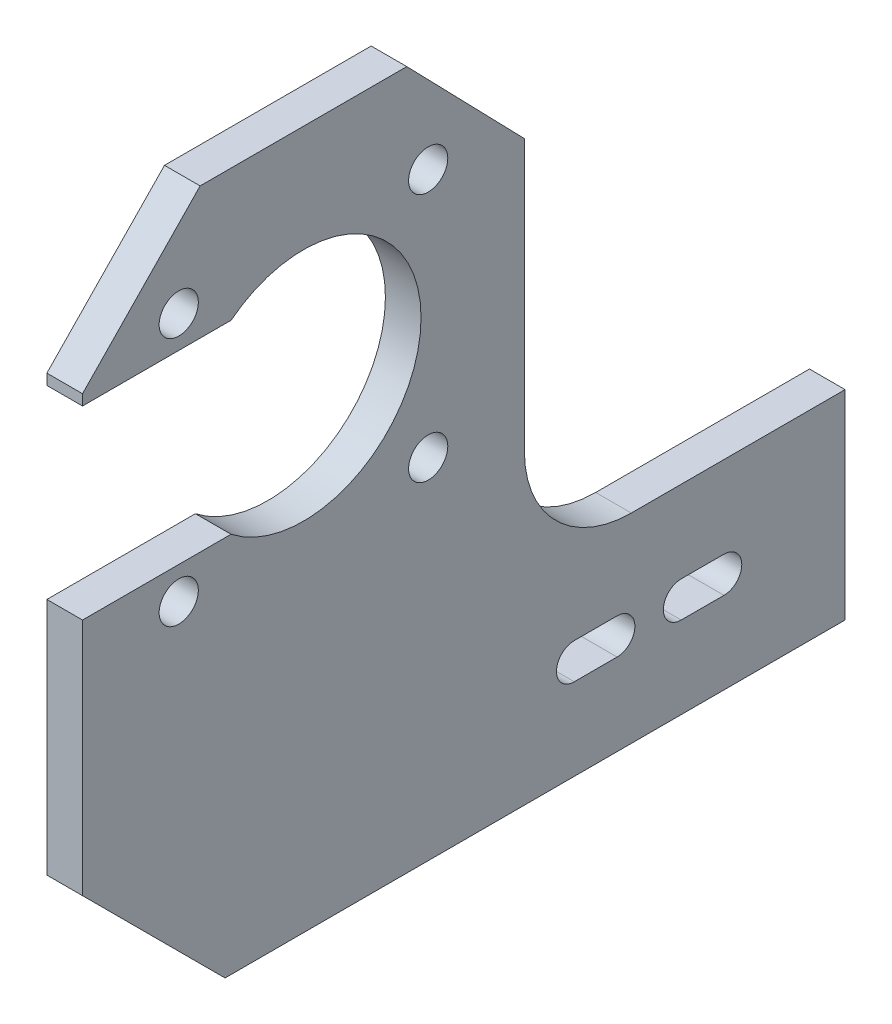
ISO-10303-21;
HEADER;
FILE_DESCRIPTION(('STEP AP214'),'2;1');
FILE_NAME('part.step','',(''),(''),'','','');
FILE_SCHEMA(('AUTOMOTIVE_DESIGN { 1 0 10303 214 1 1 1 1 }'));
ENDSEC;
DATA;
#1=APPLICATION_CONTEXT('core data for automotive mechanical design processes');
#2=APPLICATION_PROTOCOL_DEFINITION('international standard','automotive_design',2000,#1);
#3=PRODUCT_CONTEXT('',#1,'mechanical');
#4=PRODUCT('Part','Part','',(#3));
#5=PRODUCT_RELATED_PRODUCT_CATEGORY('part','',(#4));
#6=PRODUCT_DEFINITION_FORMATION('','',#4);
#7=PRODUCT_DEFINITION_CONTEXT('part definition',#1,'design');
#8=PRODUCT_DEFINITION('design','',#6,#7);
#9=PRODUCT_DEFINITION_SHAPE('','',#8);
#10=(LENGTH_UNIT() NAMED_UNIT(*) SI_UNIT(.MILLI.,.METRE.));
#11=(NAMED_UNIT(*) PLANE_ANGLE_UNIT() SI_UNIT($,.RADIAN.));
#12=(NAMED_UNIT(*) SI_UNIT($,.STERADIAN.) SOLID_ANGLE_UNIT());
#13=UNCERTAINTY_MEASURE_WITH_UNIT(LENGTH_MEASURE(1.E-05),#10,'distance_accuracy_value','');
#14=(GEOMETRIC_REPRESENTATION_CONTEXT(3) GLOBAL_UNCERTAINTY_ASSIGNED_CONTEXT((#13)) GLOBAL_UNIT_ASSIGNED_CONTEXT((#10,
#11,#12)) REPRESENTATION_CONTEXT('',''));
#15=CARTESIAN_POINT('',(0.,0.,0.));
#16=DIRECTION('',(0.,0.,1.));
#17=DIRECTION('',(1.,0.,0.));
#18=AXIS2_PLACEMENT_3D('',#15,#16,#17);
#19=CARTESIAN_POINT('',(-5.,34.5,-31.));
#20=DIRECTION('',(1.,0.,0.));
#21=DIRECTION('',(0.,0.,-1.));
#22=AXIS2_PLACEMENT_3D('',#19,#20,#21);
#23=CYLINDRICAL_SURFACE('',#22,16.5);
#24=CARTESIAN_POINT('',(0.,34.5,-31.));
#25=DIRECTION('',(1.,0.,0.));
#26=DIRECTION('',(0.,0.,-1.));
#27=AXIS2_PLACEMENT_3D('',#24,#25,#26);
#28=CIRCLE('',#27,16.5);
#29=CARTESIAN_POINT('',(0.,21.5,-20.8387992835492));
#30=VERTEX_POINT('',#29);
#31=CARTESIAN_POINT('',(0.,47.5,-20.8387992835492));
#32=VERTEX_POINT('',#31);
#33=EDGE_CURVE('E330',#30,#32,#28,.T.);
#34=ORIENTED_EDGE('',*,*,#33,.T.);
#35=DIRECTION('',(1.,0.,0.));
#36=VECTOR('',#35,1.);
#37=CARTESIAN_POINT('',(-5.,47.5,-20.8387992835492));
#38=LINE('',#37,#36);
#39=CARTESIAN_POINT('',(-5.,47.5,-20.8387992835492));
#40=VERTEX_POINT('',#39);
#41=EDGE_CURVE('E377',#40,#32,#38,.T.);
#42=ORIENTED_EDGE('',*,*,#41,.F.);
#43=CARTESIAN_POINT('',(-5.,34.5,-31.));
#44=DIRECTION('',(1.,0.,0.));
#45=DIRECTION('',(0.,0.,-1.));
#46=AXIS2_PLACEMENT_3D('',#43,#44,#45);
#47=CIRCLE('',#46,16.5);
#48=CARTESIAN_POINT('',(-5.,21.5,-20.8387992835492));
#49=VERTEX_POINT('',#48);
#50=EDGE_CURVE('E248',#49,#40,#47,.T.);
#51=ORIENTED_EDGE('',*,*,#50,.F.);
#52=DIRECTION('',(1.,0.,0.));
#53=VECTOR('',#52,1.);
#54=CARTESIAN_POINT('',(-5.,21.5,-20.8387992835492));
#55=LINE('',#54,#53);
#56=EDGE_CURVE('E410',#49,#30,#55,.T.);
#57=ORIENTED_EDGE('',*,*,#56,.T.);
#58=EDGE_LOOP('',(#34,#42,#51,#57));
#59=FACE_BOUND('',#58,.T.);
#60=ADVANCED_FACE('F43',(#59),#23,.F.);
#61=CARTESIAN_POINT('',(-5.,47.5,0.));
#62=DIRECTION('',(0.,-1.,0.));
#63=DIRECTION('',(0.,0.,-1.));
#64=AXIS2_PLACEMENT_3D('',#61,#62,#63);
#65=PLANE('',#64);
#66=DIRECTION('',(0.,0.,-1.));
#67=VECTOR('',#66,1.);
#68=CARTESIAN_POINT('',(0.,47.5,0.));
#69=LINE('',#68,#67);
#70=CARTESIAN_POINT('',(0.,47.5,-1.00829253129798E-13));
#71=VERTEX_POINT('',#70);
#72=EDGE_CURVE('E368',#71,#32,#69,.T.);
#73=ORIENTED_EDGE('',*,*,#72,.F.);
#74=DIRECTION('',(1.,0.,0.));
#75=VECTOR('',#74,1.);
#76=CARTESIAN_POINT('',(-5.,47.5,-1.00829253129798E-13));
#77=LINE('',#76,#75);
#78=CARTESIAN_POINT('',(-5.,47.5,-1.00829253129798E-13));
#79=VERTEX_POINT('',#78);
#80=EDGE_CURVE('E381',#79,#71,#77,.T.);
#81=ORIENTED_EDGE('',*,*,#80,.F.);
#82=DIRECTION('',(0.,0.,-1.));
#83=VECTOR('',#82,1.);
#84=CARTESIAN_POINT('',(-5.,47.5,0.));
#85=LINE('',#84,#83);
#86=EDGE_CURVE('E285',#79,#40,#85,.T.);
#87=ORIENTED_EDGE('',*,*,#86,.T.);
#88=ORIENTED_EDGE('',*,*,#41,.T.);
#89=EDGE_LOOP('',(#73,#81,#87,#88));
#90=FACE_BOUND('',#89,.T.);
#91=ADVANCED_FACE('F483',(#90),#65,.T.);
#92=CARTESIAN_POINT('',(-5.,0.,0.));
#93=DIRECTION('',(0.,0.,1.));
#94=DIRECTION('',(0.,-1.,0.));
#95=AXIS2_PLACEMENT_3D('',#92,#93,#94);
#96=PLANE('',#95);
#97=DIRECTION('',(0.,-1.,0.));
#98=VECTOR('',#97,1.);
#99=CARTESIAN_POINT('',(0.,0.,0.));
#100=LINE('',#99,#98);
#101=CARTESIAN_POINT('',(0.,49.,0.));
#102=VERTEX_POINT('',#101);
#103=EDGE_CURVE('E364',#102,#71,#100,.T.);
#104=ORIENTED_EDGE('',*,*,#103,.F.);
#105=DIRECTION('',(1.,0.,0.));
#106=VECTOR('',#105,1.);
#107=CARTESIAN_POINT('',(-5.,49.,0.));
#108=LINE('',#107,#106);
#109=CARTESIAN_POINT('',(-5.,49.,0.));
#110=VERTEX_POINT('',#109);
#111=EDGE_CURVE('E384',#110,#102,#108,.T.);
#112=ORIENTED_EDGE('',*,*,#111,.F.);
#113=DIRECTION('',(0.,-1.,0.));
#114=VECTOR('',#113,1.);
#115=CARTESIAN_POINT('',(-5.,0.,0.));
#116=LINE('',#115,#114);
#117=EDGE_CURVE('E281',#110,#79,#116,.T.);
#118=ORIENTED_EDGE('',*,*,#117,.T.);
#119=ORIENTED_EDGE('',*,*,#80,.T.);
#120=EDGE_LOOP('',(#104,#112,#118,#119));
#121=FACE_BOUND('',#120,.T.);
#122=ADVANCED_FACE('F488',(#121),#96,.T.);
#123=CARTESIAN_POINT('',(-5.,23.7688195991091,24.4890868596882));
#124=DIRECTION('',(0.,-0.69647537716866,-0.717580691628317));
#125=DIRECTION('',(0.,0.717580691628317,-0.69647537716866));
#126=AXIS2_PLACEMENT_3D('',#123,#124,#125);
#127=PLANE('',#126);
#128=DIRECTION('',(0.,0.717580691628317,-0.69647537716866));
#129=VECTOR('',#128,1.);
#130=CARTESIAN_POINT('',(0.,23.7688195991091,24.4890868596882));
#131=LINE('',#130,#129);
#132=CARTESIAN_POINT('',(0.,66.,-16.5));
#133=VERTEX_POINT('',#132);
#134=EDGE_CURVE('E361',#102,#133,#131,.T.);
#135=ORIENTED_EDGE('',*,*,#134,.T.);
#136=DIRECTION('',(1.,0.,0.));
#137=VECTOR('',#136,1.);
#138=CARTESIAN_POINT('',(-5.,66.,-16.5));
#139=LINE('',#138,#137);
#140=CARTESIAN_POINT('',(-5.,66.,-16.5));
#141=VERTEX_POINT('',#140);
#142=EDGE_CURVE('E387',#141,#133,#139,.T.);
#143=ORIENTED_EDGE('',*,*,#142,.F.);
#144=DIRECTION('',(0.,0.717580691628317,-0.69647537716866));
#145=VECTOR('',#144,1.);
#146=CARTESIAN_POINT('',(-5.,23.7688195991091,24.4890868596882));
#147=LINE('',#146,#145);
#148=EDGE_CURVE('E278',#110,#141,#147,.T.);
#149=ORIENTED_EDGE('',*,*,#148,.F.);
#150=ORIENTED_EDGE('',*,*,#111,.T.);
#151=EDGE_LOOP('',(#135,#143,#149,#150));
#152=FACE_BOUND('',#151,.T.);
#153=ADVANCED_FACE('F572',(#152),#127,.F.);
#154=CARTESIAN_POINT('',(-5.,66.,0.));
#155=DIRECTION('',(0.,-1.,0.));
#156=DIRECTION('',(0.,0.,-1.));
#157=AXIS2_PLACEMENT_3D('',#154,#155,#156);
#158=PLANE('',#157);
#159=DIRECTION('',(0.,0.,-1.));
#160=VECTOR('',#159,1.);
#161=CARTESIAN_POINT('',(0.,66.,0.));
#162=LINE('',#161,#160);
#163=CARTESIAN_POINT('',(0.,66.,-45.5));
#164=VERTEX_POINT('',#163);
#165=EDGE_CURVE('E358',#133,#164,#162,.T.);
#166=ORIENTED_EDGE('',*,*,#165,.T.);
#167=DIRECTION('',(1.,0.,0.));
#168=VECTOR('',#167,1.);
#169=CARTESIAN_POINT('',(-5.,66.,-45.5));
#170=LINE('',#169,#168);
#171=CARTESIAN_POINT('',(-5.,66.,-45.5));
#172=VERTEX_POINT('',#171);
#173=EDGE_CURVE('E391',#172,#164,#170,.T.);
#174=ORIENTED_EDGE('',*,*,#173,.F.);
#175=DIRECTION('',(0.,0.,-1.));
#176=VECTOR('',#175,1.);
#177=CARTESIAN_POINT('',(-5.,66.,0.));
#178=LINE('',#177,#176);
#179=EDGE_CURVE('E275',#141,#172,#178,.T.);
#180=ORIENTED_EDGE('',*,*,#179,.F.);
#181=ORIENTED_EDGE('',*,*,#142,.T.);
#182=EDGE_LOOP('',(#166,#174,#180,#181));
#183=FACE_BOUND('',#182,.T.);
#184=ADVANCED_FACE('F576',(#183),#158,.F.);
#185=CARTESIAN_POINT('',(-5.,54.7550111358575,-56.4142538975501));
#186=DIRECTION('',(0.,-0.69647537716866,0.717580691628316));
#187=DIRECTION('',(0.,-0.717580691628316,-0.69647537716866));
#188=AXIS2_PLACEMENT_3D('',#185,#186,#187);
#189=PLANE('',#188);
#190=DIRECTION('',(0.,-0.717580691628316,-0.69647537716866));
#191=VECTOR('',#190,1.);
#192=CARTESIAN_POINT('',(0.,54.7550111358575,-56.4142538975501));
#193=LINE('',#192,#191);
#194=CARTESIAN_POINT('',(0.,49.,-62.));
#195=VERTEX_POINT('',#194);
#196=EDGE_CURVE('E354',#164,#195,#193,.T.);
#197=ORIENTED_EDGE('',*,*,#196,.T.);
#198=DIRECTION('',(1.,0.,0.));
#199=VECTOR('',#198,1.);
#200=CARTESIAN_POINT('',(-5.,49.,-62.));
#201=LINE('',#200,#199);
#202=CARTESIAN_POINT('',(-5.,49.,-62.));
#203=VERTEX_POINT('',#202);
#204=EDGE_CURVE('E395',#203,#195,#201,.T.);
#205=ORIENTED_EDGE('',*,*,#204,.F.);
#206=DIRECTION('',(0.,-0.717580691628316,-0.69647537716866));
#207=VECTOR('',#206,1.);
#208=CARTESIAN_POINT('',(-5.,54.7550111358575,-56.4142538975501));
#209=LINE('',#208,#207);
#210=EDGE_CURVE('E271',#172,#203,#209,.T.);
#211=ORIENTED_EDGE('',*,*,#210,.F.);
#212=ORIENTED_EDGE('',*,*,#173,.T.);
#213=EDGE_LOOP('',(#197,#205,#211,#212));
#214=FACE_BOUND('',#213,.T.);
#215=ADVANCED_FACE('F580',(#214),#189,.F.);
#216=CARTESIAN_POINT('',(-5.,0.,-62.));
#217=DIRECTION('',(0.,0.,-1.));
#218=DIRECTION('',(-1.,0.,0.));
#219=AXIS2_PLACEMENT_3D('',#216,#217,#218);
#220=PLANE('',#219);
#221=DIRECTION('',(0.,1.,0.));
#222=VECTOR('',#221,1.);
#223=CARTESIAN_POINT('',(0.,0.,-62.));
#224=LINE('',#223,#222);
#225=CARTESIAN_POINT('',(0.,11.,-62.));
#226=VERTEX_POINT('',#225);
#227=EDGE_CURVE('E351',#226,#195,#224,.T.);
#228=ORIENTED_EDGE('',*,*,#227,.F.);
#229=DIRECTION('',(1.,0.,0.));
#230=VECTOR('',#229,1.);
#231=CARTESIAN_POINT('',(-5.,11.,-62.));
#232=LINE('',#231,#230);
#233=CARTESIAN_POINT('',(-5.,11.,-62.));
#234=VERTEX_POINT('',#233);
#235=EDGE_CURVE('E438',#226,#234,#232,.F.);
#236=ORIENTED_EDGE('',*,*,#235,.T.);
#237=DIRECTION('',(0.,1.,0.));
#238=VECTOR('',#237,1.);
#239=CARTESIAN_POINT('',(-5.,0.,-62.));
#240=LINE('',#239,#238);
#241=EDGE_CURVE('E268',#234,#203,#240,.T.);
#242=ORIENTED_EDGE('',*,*,#241,.T.);
#243=ORIENTED_EDGE('',*,*,#204,.T.);
#244=EDGE_LOOP('',(#228,#236,#242,#243));
#245=FACE_BOUND('',#244,.T.);
#246=ADVANCED_FACE('F584',(#245),#220,.T.);
#247=CARTESIAN_POINT('',(-5.,-4.00000000000001,0.));
#248=DIRECTION('',(0.,1.,0.));
#249=DIRECTION('',(0.,0.,1.));
#250=AXIS2_PLACEMENT_3D('',#247,#248,#249);
#251=PLANE('',#250);
#252=DIRECTION('',(0.,0.,1.));
#253=VECTOR('',#252,1.);
#254=CARTESIAN_POINT('',(-5.,-4.00000000000001,0.));
#255=LINE('',#254,#253);
#256=CARTESIAN_POINT('',(-5.,-4.,-107.));
#257=VERTEX_POINT('',#256);
#258=CARTESIAN_POINT('',(-5.,-4.,-77.));
#259=VERTEX_POINT('',#258);
#260=EDGE_CURVE('E264',#257,#259,#255,.T.);
#261=ORIENTED_EDGE('',*,*,#260,.T.);
#262=DIRECTION('',(1.,0.,0.));
#263=VECTOR('',#262,1.);
#264=CARTESIAN_POINT('',(0.,-4.,-77.));
#265=LINE('',#264,#263);
#266=CARTESIAN_POINT('',(0.,-4.,-77.));
#267=VERTEX_POINT('',#266);
#268=EDGE_CURVE('E380',#259,#267,#265,.T.);
#269=ORIENTED_EDGE('',*,*,#268,.T.);
#270=DIRECTION('',(0.,0.,1.));
#271=VECTOR('',#270,1.);
#272=CARTESIAN_POINT('',(0.,-4.00000000000001,0.));
#273=LINE('',#272,#271);
#274=CARTESIAN_POINT('',(0.,-4.,-107.));
#275=VERTEX_POINT('',#274);
#276=EDGE_CURVE('E347',#275,#267,#273,.T.);
#277=ORIENTED_EDGE('',*,*,#276,.F.);
#278=DIRECTION('',(1.,0.,0.));
#279=VECTOR('',#278,1.);
#280=CARTESIAN_POINT('',(-5.,-4.,-107.));
#281=LINE('',#280,#279);
#282=EDGE_CURVE('E399',#257,#275,#281,.T.);
#283=ORIENTED_EDGE('',*,*,#282,.F.);
#284=EDGE_LOOP('',(#261,#269,#277,#283));
#285=FACE_BOUND('',#284,.T.);
#286=ADVANCED_FACE('F588',(#285),#251,.T.);
#287=CARTESIAN_POINT('',(-5.,0.,-107.));
#288=DIRECTION('',(0.,0.,-1.));
#289=DIRECTION('',(-1.,0.,0.));
#290=AXIS2_PLACEMENT_3D('',#287,#288,#289);
#291=PLANE('',#290);
#292=DIRECTION('',(0.,1.,0.));
#293=VECTOR('',#292,1.);
#294=CARTESIAN_POINT('',(0.,0.,-107.));
#295=LINE('',#294,#293);
#296=CARTESIAN_POINT('',(0.,-32.,-107.));
#297=VERTEX_POINT('',#296);
#298=EDGE_CURVE('E343',#297,#275,#295,.T.);
#299=ORIENTED_EDGE('',*,*,#298,.F.);
#300=DIRECTION('',(1.,0.,0.));
#301=VECTOR('',#300,1.);
#302=CARTESIAN_POINT('',(-5.,-32.,-107.));
#303=LINE('',#302,#301);
#304=CARTESIAN_POINT('',(-5.,-32.,-107.));
#305=VERTEX_POINT('',#304);
#306=EDGE_CURVE('E402',#305,#297,#303,.T.);
#307=ORIENTED_EDGE('',*,*,#306,.F.);
#308=DIRECTION('',(0.,1.,0.));
#309=VECTOR('',#308,1.);
#310=CARTESIAN_POINT('',(-5.,0.,-107.));
#311=LINE('',#310,#309);
#312=EDGE_CURVE('E260',#305,#257,#311,.T.);
#313=ORIENTED_EDGE('',*,*,#312,.T.);
#314=ORIENTED_EDGE('',*,*,#282,.T.);
#315=EDGE_LOOP('',(#299,#307,#313,#314));
#316=FACE_BOUND('',#315,.T.);
#317=ADVANCED_FACE('F592',(#316),#291,.T.);
#318=CARTESIAN_POINT('',(-5.,-32.,0.));
#319=DIRECTION('',(0.,-1.,0.));
#320=DIRECTION('',(0.,0.,-1.));
#321=AXIS2_PLACEMENT_3D('',#318,#319,#320);
#322=PLANE('',#321);
#323=DIRECTION('',(0.,0.,-1.));
#324=VECTOR('',#323,1.);
#325=CARTESIAN_POINT('',(0.,-32.,0.));
#326=LINE('',#325,#324);
#327=CARTESIAN_POINT('',(0.,-32.,-20.0000000000001));
#328=VERTEX_POINT('',#327);
#329=EDGE_CURVE('E340',#328,#297,#326,.T.);
#330=ORIENTED_EDGE('',*,*,#329,.F.);
#331=DIRECTION('',(-1.,0.,0.));
#332=VECTOR('',#331,1.);
#333=CARTESIAN_POINT('',(-5.,-32.,-20.0000000000001));
#334=LINE('',#333,#332);
#335=CARTESIAN_POINT('',(-5.,-32.,-20.0000000000001));
#336=VERTEX_POINT('',#335);
#337=EDGE_CURVE('E53',#328,#336,#334,.T.);
#338=ORIENTED_EDGE('',*,*,#337,.T.);
#339=DIRECTION('',(0.,0.,-1.));
#340=VECTOR('',#339,1.);
#341=CARTESIAN_POINT('',(-5.,-32.,0.));
#342=LINE('',#341,#340);
#343=EDGE_CURVE('E257',#336,#305,#342,.T.);
#344=ORIENTED_EDGE('',*,*,#343,.T.);
#345=ORIENTED_EDGE('',*,*,#306,.T.);
#346=EDGE_LOOP('',(#330,#338,#344,#345));
#347=FACE_BOUND('',#346,.T.);
#348=ADVANCED_FACE('F596',(#347),#322,.T.);
#349=CARTESIAN_POINT('',(-5.,0.,0.));
#350=DIRECTION('',(0.,0.,-1.));
#351=DIRECTION('',(-1.,0.,0.));
#352=AXIS2_PLACEMENT_3D('',#349,#350,#351);
#353=PLANE('',#352);
#354=DIRECTION('',(0.,1.,0.));
#355=VECTOR('',#354,1.);
#356=CARTESIAN_POINT('',(-5.,0.,0.));
#357=LINE('',#356,#355);
#358=CARTESIAN_POINT('',(-5.,-12.,0.));
#359=VERTEX_POINT('',#358);
#360=CARTESIAN_POINT('',(-5.,21.5,0.));
#361=VERTEX_POINT('',#360);
#362=EDGE_CURVE('E254',#359,#361,#357,.T.);
#363=ORIENTED_EDGE('',*,*,#362,.F.);
#364=DIRECTION('',(1.,0.,0.));
#365=VECTOR('',#364,1.);
#366=CARTESIAN_POINT('',(0.,-12.,0.));
#367=LINE('',#366,#365);
#368=CARTESIAN_POINT('',(0.,-12.,0.));
#369=VERTEX_POINT('',#368);
#370=EDGE_CURVE('E447',#359,#369,#367,.T.);
#371=ORIENTED_EDGE('',*,*,#370,.T.);
#372=DIRECTION('',(0.,1.,0.));
#373=VECTOR('',#372,1.);
#374=CARTESIAN_POINT('',(0.,0.,0.));
#375=LINE('',#374,#373);
#376=CARTESIAN_POINT('',(0.,21.5,0.));
#377=VERTEX_POINT('',#376);
#378=EDGE_CURVE('E337',#369,#377,#375,.T.);
#379=ORIENTED_EDGE('',*,*,#378,.T.);
#380=DIRECTION('',(1.,0.,0.));
#381=VECTOR('',#380,1.);
#382=CARTESIAN_POINT('',(-5.,21.5,0.));
#383=LINE('',#382,#381);
#384=EDGE_CURVE('E406',#361,#377,#383,.T.);
#385=ORIENTED_EDGE('',*,*,#384,.F.);
#386=EDGE_LOOP('',(#363,#371,#379,#385));
#387=FACE_BOUND('',#386,.T.);
#388=ADVANCED_FACE('F456',(#387),#353,.F.);
#389=CARTESIAN_POINT('',(-5.,-18.,-75.));
#390=DIRECTION('',(1.,0.,0.));
#391=DIRECTION('',(0.,0.,-1.));
#392=AXIS2_PLACEMENT_3D('',#389,#390,#391);
#393=CYLINDRICAL_SURFACE('',#392,2.5);
#394=CARTESIAN_POINT('',(0.,-18.,-75.));
#395=DIRECTION('',(1.,0.,0.));
#396=DIRECTION('',(0.,0.,-1.));
#397=AXIS2_PLACEMENT_3D('',#394,#395,#396);
#398=CIRCLE('',#397,2.5);
#399=CARTESIAN_POINT('',(0.,-20.5,-75.));
#400=VERTEX_POINT('',#399);
#401=CARTESIAN_POINT('',(0.,-15.5,-75.));
#402=VERTEX_POINT('',#401);
#403=EDGE_CURVE('E316',#400,#402,#398,.T.);
#404=ORIENTED_EDGE('',*,*,#403,.T.);
#405=DIRECTION('',(1.,0.,0.));
#406=VECTOR('',#405,1.);
#407=CARTESIAN_POINT('',(-5.,-15.5,-75.));
#408=LINE('',#407,#406);
#409=CARTESIAN_POINT('',(-5.,-15.5,-75.));
#410=VERTEX_POINT('',#409);
#411=EDGE_CURVE('E414',#410,#402,#408,.T.);
#412=ORIENTED_EDGE('',*,*,#411,.F.);
#413=CARTESIAN_POINT('',(-5.,-18.,-75.));
#414=DIRECTION('',(1.,0.,0.));
#415=DIRECTION('',(0.,0.,-1.));
#416=AXIS2_PLACEMENT_3D('',#413,#414,#415);
#417=CIRCLE('',#416,2.5);
#418=CARTESIAN_POINT('',(-5.,-20.5,-75.));
#419=VERTEX_POINT('',#418);
#420=EDGE_CURVE('E235',#419,#410,#417,.T.);
#421=ORIENTED_EDGE('',*,*,#420,.F.);
#422=DIRECTION('',(1.,0.,0.));
#423=VECTOR('',#422,1.);
#424=CARTESIAN_POINT('',(-5.,-20.5,-75.));
#425=LINE('',#424,#423);
#426=EDGE_CURVE('E424',#419,#400,#425,.T.);
#427=ORIENTED_EDGE('',*,*,#426,.T.);
#428=EDGE_LOOP('',(#404,#412,#421,#427));
#429=FACE_BOUND('',#428,.T.);
#430=ADVANCED_FACE('F498',(#429),#393,.F.);
#431=CARTESIAN_POINT('',(-5.,-15.5,0.));
#432=DIRECTION('',(0.,-1.,0.));
#433=DIRECTION('',(0.,0.,-1.));
#434=AXIS2_PLACEMENT_3D('',#431,#432,#433);
#435=PLANE('',#434);
#436=DIRECTION('',(0.,0.,-1.));
#437=VECTOR('',#436,1.);
#438=CARTESIAN_POINT('',(0.,-15.5,0.));
#439=LINE('',#438,#437);
#440=CARTESIAN_POINT('',(0.,-15.5,-69.));
#441=VERTEX_POINT('',#440);
#442=EDGE_CURVE('E326',#441,#402,#439,.T.);
#443=ORIENTED_EDGE('',*,*,#442,.F.);
#444=DIRECTION('',(1.,0.,0.));
#445=VECTOR('',#444,1.);
#446=CARTESIAN_POINT('',(-5.,-15.5,-69.));
#447=LINE('',#446,#445);
#448=CARTESIAN_POINT('',(-5.,-15.5,-69.));
#449=VERTEX_POINT('',#448);
#450=EDGE_CURVE('E417',#449,#441,#447,.T.);
#451=ORIENTED_EDGE('',*,*,#450,.F.);
#452=DIRECTION('',(0.,0.,-1.));
#453=VECTOR('',#452,1.);
#454=CARTESIAN_POINT('',(-5.,-15.5,0.));
#455=LINE('',#454,#453);
#456=EDGE_CURVE('E244',#449,#410,#455,.T.);
#457=ORIENTED_EDGE('',*,*,#456,.T.);
#458=ORIENTED_EDGE('',*,*,#411,.T.);
#459=EDGE_LOOP('',(#443,#451,#457,#458));
#460=FACE_BOUND('',#459,.T.);
#461=ADVANCED_FACE('F494',(#460),#435,.T.);
#462=CARTESIAN_POINT('',(-5.,-18.,-69.));
#463=DIRECTION('',(1.,0.,0.));
#464=DIRECTION('',(0.,0.,-1.));
#465=AXIS2_PLACEMENT_3D('',#462,#463,#464);
#466=CYLINDRICAL_SURFACE('',#465,2.5);
#467=CARTESIAN_POINT('',(0.,-18.,-69.));
#468=DIRECTION('',(1.,0.,0.));
#469=DIRECTION('',(0.,0.,-1.));
#470=AXIS2_PLACEMENT_3D('',#467,#468,#469);
#471=CIRCLE('',#470,2.5);
#472=CARTESIAN_POINT('',(0.,-20.5,-69.));
#473=VERTEX_POINT('',#472);
#474=EDGE_CURVE('E323',#441,#473,#471,.T.);
#475=ORIENTED_EDGE('',*,*,#474,.T.);
#476=DIRECTION('',(1.,0.,0.));
#477=VECTOR('',#476,1.);
#478=CARTESIAN_POINT('',(-5.,-20.5,-69.));
#479=LINE('',#478,#477);
#480=CARTESIAN_POINT('',(-5.,-20.5,-69.));
#481=VERTEX_POINT('',#480);
#482=EDGE_CURVE('E420',#481,#473,#479,.T.);
#483=ORIENTED_EDGE('',*,*,#482,.F.);
#484=CARTESIAN_POINT('',(-5.,-18.,-69.));
#485=DIRECTION('',(1.,0.,0.));
#486=DIRECTION('',(0.,0.,-1.));
#487=AXIS2_PLACEMENT_3D('',#484,#485,#486);
#488=CIRCLE('',#487,2.5);
#489=EDGE_CURVE('E241',#449,#481,#488,.T.);
#490=ORIENTED_EDGE('',*,*,#489,.F.);
#491=ORIENTED_EDGE('',*,*,#450,.T.);
#492=EDGE_LOOP('',(#475,#483,#490,#491));
#493=FACE_BOUND('',#492,.T.);
#494=ADVANCED_FACE('F497',(#493),#466,.F.);
#495=CARTESIAN_POINT('',(-5.,-18.,-90.));
#496=DIRECTION('',(1.,0.,0.));
#497=DIRECTION('',(0.,0.,-1.));
#498=AXIS2_PLACEMENT_3D('',#495,#496,#497);
#499=CYLINDRICAL_SURFACE('',#498,2.5);
#500=CARTESIAN_POINT('',(0.,-18.,-90.));
#501=DIRECTION('',(1.,0.,0.));
#502=DIRECTION('',(0.,0.,-1.));
#503=AXIS2_PLACEMENT_3D('',#500,#501,#502);
#504=CIRCLE('',#503,2.5);
#505=CARTESIAN_POINT('',(0.,-20.5,-90.));
#506=VERTEX_POINT('',#505);
#507=CARTESIAN_POINT('',(0.,-15.5,-90.));
#508=VERTEX_POINT('',#507);
#509=EDGE_CURVE('E304',#506,#508,#504,.T.);
#510=ORIENTED_EDGE('',*,*,#509,.T.);
#511=DIRECTION('',(1.,0.,0.));
#512=VECTOR('',#511,1.);
#513=CARTESIAN_POINT('',(-5.,-15.5,-90.));
#514=LINE('',#513,#512);
#515=CARTESIAN_POINT('',(-5.,-15.5,-90.));
#516=VERTEX_POINT('',#515);
#517=EDGE_CURVE('E219',#516,#508,#514,.T.);
#518=ORIENTED_EDGE('',*,*,#517,.F.);
#519=CARTESIAN_POINT('',(-5.,-18.,-90.));
#520=DIRECTION('',(1.,0.,0.));
#521=DIRECTION('',(0.,0.,-1.));
#522=AXIS2_PLACEMENT_3D('',#519,#520,#521);
#523=CIRCLE('',#522,2.5);
#524=CARTESIAN_POINT('',(-5.,-20.5,-90.));
#525=VERTEX_POINT('',#524);
#526=EDGE_CURVE('E197',#525,#516,#523,.T.);
#527=ORIENTED_EDGE('',*,*,#526,.F.);
#528=DIRECTION('',(1.,0.,0.));
#529=VECTOR('',#528,1.);
#530=CARTESIAN_POINT('',(-5.,-20.5,-90.));
#531=LINE('',#530,#529);
#532=EDGE_CURVE('E207',#525,#506,#531,.T.);
#533=ORIENTED_EDGE('',*,*,#532,.T.);
#534=EDGE_LOOP('',(#510,#518,#527,#533));
#535=FACE_BOUND('',#534,.T.);
#536=ADVANCED_FACE('F218',(#535),#499,.F.);
#537=CARTESIAN_POINT('',(-5.,-15.5,0.));
#538=DIRECTION('',(0.,-1.,0.));
#539=DIRECTION('',(0.,0.,-1.));
#540=AXIS2_PLACEMENT_3D('',#537,#538,#539);
#541=PLANE('',#540);
#542=DIRECTION('',(0.,0.,-1.));
#543=VECTOR('',#542,1.);
#544=CARTESIAN_POINT('',(0.,-15.5,0.));
#545=LINE('',#544,#543);
#546=CARTESIAN_POINT('',(0.,-15.5,-84.));
#547=VERTEX_POINT('',#546);
#548=EDGE_CURVE('E312',#547,#508,#545,.T.);
#549=ORIENTED_EDGE('',*,*,#548,.F.);
#550=DIRECTION('',(1.,0.,0.));
#551=VECTOR('',#550,1.);
#552=CARTESIAN_POINT('',(-5.,-15.5,-84.));
#553=LINE('',#552,#551);
#554=CARTESIAN_POINT('',(-5.,-15.5,-84.));
#555=VERTEX_POINT('',#554);
#556=EDGE_CURVE('E430',#555,#547,#553,.T.);
#557=ORIENTED_EDGE('',*,*,#556,.F.);
#558=DIRECTION('',(0.,0.,-1.));
#559=VECTOR('',#558,1.);
#560=CARTESIAN_POINT('',(-5.,-15.5,0.));
#561=LINE('',#560,#559);
#562=EDGE_CURVE('E232',#555,#516,#561,.T.);
#563=ORIENTED_EDGE('',*,*,#562,.T.);
#564=ORIENTED_EDGE('',*,*,#517,.T.);
#565=EDGE_LOOP('',(#549,#557,#563,#564));
#566=FACE_BOUND('',#565,.T.);
#567=ADVANCED_FACE('F510',(#566),#541,.T.);
#568=CARTESIAN_POINT('',(-5.,-18.,-84.));
#569=DIRECTION('',(1.,0.,0.));
#570=DIRECTION('',(0.,0.,-1.));
#571=AXIS2_PLACEMENT_3D('',#568,#569,#570);
#572=CYLINDRICAL_SURFACE('',#571,2.5);
#573=CARTESIAN_POINT('',(0.,-18.,-84.));
#574=DIRECTION('',(1.,0.,0.));
#575=DIRECTION('',(0.,0.,-1.));
#576=AXIS2_PLACEMENT_3D('',#573,#574,#575);
#577=CIRCLE('',#576,2.5);
#578=CARTESIAN_POINT('',(0.,-20.5,-84.));
#579=VERTEX_POINT('',#578);
#580=EDGE_CURVE('E309',#547,#579,#577,.T.);
#581=ORIENTED_EDGE('',*,*,#580,.T.);
#582=DIRECTION('',(1.,0.,0.));
#583=VECTOR('',#582,1.);
#584=CARTESIAN_POINT('',(-5.,-20.5,-84.));
#585=LINE('',#584,#583);
#586=CARTESIAN_POINT('',(-5.,-20.5,-84.));
#587=VERTEX_POINT('',#586);
#588=EDGE_CURVE('E215',#587,#579,#585,.T.);
#589=ORIENTED_EDGE('',*,*,#588,.F.);
#590=CARTESIAN_POINT('',(-5.,-18.,-84.));
#591=DIRECTION('',(1.,0.,0.));
#592=DIRECTION('',(0.,0.,-1.));
#593=AXIS2_PLACEMENT_3D('',#590,#591,#592);
#594=CIRCLE('',#593,2.5);
#595=EDGE_CURVE('E200',#555,#587,#594,.T.);
#596=ORIENTED_EDGE('',*,*,#595,.F.);
#597=ORIENTED_EDGE('',*,*,#556,.T.);
#598=EDGE_LOOP('',(#581,#589,#596,#597));
#599=FACE_BOUND('',#598,.T.);
#600=ADVANCED_FACE('F513',(#599),#572,.F.);
#601=CARTESIAN_POINT('',(-5.,21.5,0.));
#602=DIRECTION('',(0.,-1.,0.));
#603=DIRECTION('',(0.,0.,-1.));
#604=AXIS2_PLACEMENT_3D('',#601,#602,#603);
#605=PLANE('',#604);
#606=DIRECTION('',(0.,0.,-1.));
#607=VECTOR('',#606,1.);
#608=CARTESIAN_POINT('',(0.,21.5,0.));
#609=LINE('',#608,#607);
#610=EDGE_CURVE('E334',#377,#30,#609,.T.);
#611=ORIENTED_EDGE('',*,*,#610,.T.);
#612=ORIENTED_EDGE('',*,*,#56,.F.);
#613=DIRECTION('',(0.,0.,-1.));
#614=VECTOR('',#613,1.);
#615=CARTESIAN_POINT('',(-5.,21.5,0.));
#616=LINE('',#615,#614);
#617=EDGE_CURVE('E251',#361,#49,#616,.T.);
#618=ORIENTED_EDGE('',*,*,#617,.F.);
#619=ORIENTED_EDGE('',*,*,#384,.T.);
#620=EDGE_LOOP('',(#611,#612,#618,#619));
#621=FACE_BOUND('',#620,.T.);
#622=ADVANCED_FACE('F466',(#621),#605,.F.);
#623=CARTESIAN_POINT('',(-5.,-20.5,0.));
#624=DIRECTION('',(0.,-1.,0.));
#625=DIRECTION('',(0.,0.,-1.));
#626=AXIS2_PLACEMENT_3D('',#623,#624,#625);
#627=PLANE('',#626);
#628=DIRECTION('',(0.,0.,-1.));
#629=VECTOR('',#628,1.);
#630=CARTESIAN_POINT('',(0.,-20.5,0.));
#631=LINE('',#630,#629);
#632=EDGE_CURVE('E320',#473,#400,#631,.T.);
#633=ORIENTED_EDGE('',*,*,#632,.T.);
#634=ORIENTED_EDGE('',*,*,#426,.F.);
#635=DIRECTION('',(0.,0.,-1.));
#636=VECTOR('',#635,1.);
#637=CARTESIAN_POINT('',(-5.,-20.5,0.));
#638=LINE('',#637,#636);
#639=EDGE_CURVE('E238',#481,#419,#638,.T.);
#640=ORIENTED_EDGE('',*,*,#639,.F.);
#641=ORIENTED_EDGE('',*,*,#482,.T.);
#642=EDGE_LOOP('',(#633,#634,#640,#641));
#643=FACE_BOUND('',#642,.T.);
#644=ADVANCED_FACE('F503',(#643),#627,.F.);
#645=CARTESIAN_POINT('',(-5.,-20.5,0.));
#646=DIRECTION('',(0.,-1.,0.));
#647=DIRECTION('',(0.,0.,-1.));
#648=AXIS2_PLACEMENT_3D('',#645,#646,#647);
#649=PLANE('',#648);
#650=DIRECTION('',(0.,0.,-1.));
#651=VECTOR('',#650,1.);
#652=CARTESIAN_POINT('',(0.,-20.5,0.));
#653=LINE('',#652,#651);
#654=EDGE_CURVE('E210',#579,#506,#653,.T.);
#655=ORIENTED_EDGE('',*,*,#654,.T.);
#656=ORIENTED_EDGE('',*,*,#532,.F.);
#657=DIRECTION('',(0.,0.,-1.));
#658=VECTOR('',#657,1.);
#659=CARTESIAN_POINT('',(-5.,-20.5,0.));
#660=LINE('',#659,#658);
#661=EDGE_CURVE('E191',#587,#525,#660,.T.);
#662=ORIENTED_EDGE('',*,*,#661,.F.);
#663=ORIENTED_EDGE('',*,*,#588,.T.);
#664=EDGE_LOOP('',(#655,#656,#662,#663));
#665=FACE_BOUND('',#664,.T.);
#666=ADVANCED_FACE('F208',(#665),#649,.F.);
#667=CARTESIAN_POINT('',(-5.,52.,-48.5));
#668=DIRECTION('',(1.,0.,0.));
#669=DIRECTION('',(0.,0.,-1.));
#670=AXIS2_PLACEMENT_3D('',#667,#668,#669);
#671=CYLINDRICAL_SURFACE('',#670,2.75);
#672=CARTESIAN_POINT('',(-5.,52.,-48.5));
#673=DIRECTION('',(1.,0.,0.));
#674=DIRECTION('',(0.,0.,-1.));
#675=AXIS2_PLACEMENT_3D('',#672,#673,#674);
#676=CIRCLE('',#675,2.75);
#677=CARTESIAN_POINT('',(-5.,52.,-51.25));
#678=VERTEX_POINT('',#677);
#679=EDGE_CURVE('E222',#678,#678,#676,.T.);
#680=ORIENTED_EDGE('',*,*,#679,.F.);
#681=EDGE_LOOP('',(#680));
#682=FACE_BOUND('',#681,.T.);
#683=CARTESIAN_POINT('',(0.,52.,-48.5));
#684=DIRECTION('',(1.,0.,0.));
#685=DIRECTION('',(0.,0.,-1.));
#686=AXIS2_PLACEMENT_3D('',#683,#684,#685);
#687=CIRCLE('',#686,2.75);
#688=CARTESIAN_POINT('',(0.,52.,-51.25));
#689=VERTEX_POINT('',#688);
#690=EDGE_CURVE('E300',#689,#689,#687,.T.);
#691=ORIENTED_EDGE('',*,*,#690,.T.);
#692=EDGE_LOOP('',(#691));
#693=FACE_BOUND('',#692,.T.);
#694=ADVANCED_FACE('F520',(#682,#693),#671,.F.);
#695=CARTESIAN_POINT('',(-5.,52.,-13.5));
#696=DIRECTION('',(1.,0.,0.));
#697=DIRECTION('',(0.,0.,-1.));
#698=AXIS2_PLACEMENT_3D('',#695,#696,#697);
#699=CYLINDRICAL_SURFACE('',#698,2.75);
#700=CARTESIAN_POINT('',(-5.,52.,-13.5));
#701=DIRECTION('',(1.,0.,0.));
#702=DIRECTION('',(0.,0.,-1.));
#703=AXIS2_PLACEMENT_3D('',#700,#701,#702);
#704=CIRCLE('',#703,2.75);
#705=CARTESIAN_POINT('',(-5.,52.,-16.25));
#706=VERTEX_POINT('',#705);
#707=EDGE_CURVE('E226',#706,#706,#704,.F.);
#708=ORIENTED_EDGE('',*,*,#707,.T.);
#709=EDGE_LOOP('',(#708));
#710=FACE_BOUND('',#709,.T.);
#711=CARTESIAN_POINT('',(0.,52.,-13.5));
#712=DIRECTION('',(1.,0.,0.));
#713=DIRECTION('',(0.,0.,-1.));
#714=AXIS2_PLACEMENT_3D('',#711,#712,#713);
#715=CIRCLE('',#714,2.75);
#716=CARTESIAN_POINT('',(0.,52.,-16.25));
#717=VERTEX_POINT('',#716);
#718=EDGE_CURVE('E296',#717,#717,#715,.F.);
#719=ORIENTED_EDGE('',*,*,#718,.F.);
#720=EDGE_LOOP('',(#719));
#721=FACE_BOUND('',#720,.T.);
#722=ADVANCED_FACE('F525',(#710,#721),#699,.F.);
#723=CARTESIAN_POINT('',(-5.,17.,-13.5));
#724=DIRECTION('',(1.,0.,0.));
#725=DIRECTION('',(0.,0.,-1.));
#726=AXIS2_PLACEMENT_3D('',#723,#724,#725);
#727=CYLINDRICAL_SURFACE('',#726,2.75);
#728=CARTESIAN_POINT('',(-5.,17.,-13.5));
#729=DIRECTION('',(1.,0.,0.));
#730=DIRECTION('',(0.,0.,-1.));
#731=AXIS2_PLACEMENT_3D('',#728,#729,#730);
#732=CIRCLE('',#731,2.75);
#733=CARTESIAN_POINT('',(-5.,17.,-16.25));
#734=VERTEX_POINT('',#733);
#735=EDGE_CURVE('E376',#734,#734,#732,.T.);
#736=ORIENTED_EDGE('',*,*,#735,.F.);
#737=EDGE_LOOP('',(#736));
#738=FACE_BOUND('',#737,.T.);
#739=CARTESIAN_POINT('',(0.,17.,-13.5));
#740=DIRECTION('',(1.,0.,0.));
#741=DIRECTION('',(0.,0.,-1.));
#742=AXIS2_PLACEMENT_3D('',#739,#740,#741);
#743=CIRCLE('',#742,2.75);
#744=CARTESIAN_POINT('',(0.,17.,-16.25));
#745=VERTEX_POINT('',#744);
#746=EDGE_CURVE('E292',#745,#745,#743,.T.);
#747=ORIENTED_EDGE('',*,*,#746,.T.);
#748=EDGE_LOOP('',(#747));
#749=FACE_BOUND('',#748,.T.);
#750=ADVANCED_FACE('F529',(#738,#749),#727,.F.);
#751=CARTESIAN_POINT('',(-5.,17.,-48.5));
#752=DIRECTION('',(1.,0.,0.));
#753=DIRECTION('',(0.,0.,-1.));
#754=AXIS2_PLACEMENT_3D('',#751,#752,#753);
#755=CYLINDRICAL_SURFACE('',#754,2.75);
#756=CARTESIAN_POINT('',(-5.,17.,-48.5));
#757=DIRECTION('',(1.,0.,0.));
#758=DIRECTION('',(0.,0.,-1.));
#759=AXIS2_PLACEMENT_3D('',#756,#757,#758);
#760=CIRCLE('',#759,2.75);
#761=CARTESIAN_POINT('',(-5.,17.,-51.25));
#762=VERTEX_POINT('',#761);
#763=EDGE_CURVE('E216',#762,#762,#760,.F.);
#764=ORIENTED_EDGE('',*,*,#763,.T.);
#765=EDGE_LOOP('',(#764));
#766=FACE_BOUND('',#765,.T.);
#767=CARTESIAN_POINT('',(0.,17.,-48.5));
#768=DIRECTION('',(1.,0.,0.));
#769=DIRECTION('',(0.,0.,-1.));
#770=AXIS2_PLACEMENT_3D('',#767,#768,#769);
#771=CIRCLE('',#770,2.75);
#772=CARTESIAN_POINT('',(0.,17.,-51.25));
#773=VERTEX_POINT('',#772);
#774=EDGE_CURVE('E372',#773,#773,#771,.F.);
#775=ORIENTED_EDGE('',*,*,#774,.F.);
#776=EDGE_LOOP('',(#775));
#777=FACE_BOUND('',#776,.T.);
#778=ADVANCED_FACE('F532',(#766,#777),#755,.F.);
#779=CARTESIAN_POINT('',(-5.,0.,0.));
#780=DIRECTION('',(1.,0.,0.));
#781=DIRECTION('',(0.,0.,-1.));
#782=AXIS2_PLACEMENT_3D('',#779,#780,#781);
#783=PLANE('',#782);
#784=ORIENTED_EDGE('',*,*,#735,.T.);
#785=EDGE_LOOP('',(#784));
#786=FACE_BOUND('',#785,.T.);
#787=ORIENTED_EDGE('',*,*,#707,.F.);
#788=EDGE_LOOP('',(#787));
#789=FACE_BOUND('',#788,.T.);
#790=ORIENTED_EDGE('',*,*,#679,.T.);
#791=EDGE_LOOP('',(#790));
#792=FACE_BOUND('',#791,.T.);
#793=ORIENTED_EDGE('',*,*,#526,.T.);
#794=ORIENTED_EDGE('',*,*,#562,.F.);
#795=ORIENTED_EDGE('',*,*,#595,.T.);
#796=ORIENTED_EDGE('',*,*,#661,.T.);
#797=EDGE_LOOP('',(#793,#794,#795,#796));
#798=FACE_BOUND('',#797,.T.);
#799=ORIENTED_EDGE('',*,*,#420,.T.);
#800=ORIENTED_EDGE('',*,*,#456,.F.);
#801=ORIENTED_EDGE('',*,*,#489,.T.);
#802=ORIENTED_EDGE('',*,*,#639,.T.);
#803=EDGE_LOOP('',(#799,#800,#801,#802));
#804=FACE_BOUND('',#803,.T.);
#805=ORIENTED_EDGE('',*,*,#343,.F.);
#806=DIRECTION('',(0.,0.707106781186546,0.707106781186549));
#807=VECTOR('',#806,1.);
#808=CARTESIAN_POINT('',(-5.,-12.,0.));
#809=LINE('',#808,#807);
#810=EDGE_CURVE('E11',#336,#359,#809,.T.);
#811=ORIENTED_EDGE('',*,*,#810,.T.);
#812=ORIENTED_EDGE('',*,*,#362,.T.);
#813=ORIENTED_EDGE('',*,*,#617,.T.);
#814=ORIENTED_EDGE('',*,*,#50,.T.);
#815=ORIENTED_EDGE('',*,*,#86,.F.);
#816=ORIENTED_EDGE('',*,*,#117,.F.);
#817=ORIENTED_EDGE('',*,*,#148,.T.);
#818=ORIENTED_EDGE('',*,*,#179,.T.);
#819=ORIENTED_EDGE('',*,*,#210,.T.);
#820=ORIENTED_EDGE('',*,*,#241,.F.);
#821=CARTESIAN_POINT('',(-5.,11.,-77.));
#822=DIRECTION('',(1.,0.,0.));
#823=DIRECTION('',(0.,0.,-1.));
#824=AXIS2_PLACEMENT_3D('',#821,#822,#823);
#825=CIRCLE('',#824,15.);
#826=EDGE_CURVE('E444',#234,#259,#825,.T.);
#827=ORIENTED_EDGE('',*,*,#826,.T.);
#828=ORIENTED_EDGE('',*,*,#260,.F.);
#829=ORIENTED_EDGE('',*,*,#312,.F.);
#830=EDGE_LOOP('',(#805,#811,#812,#813,#814,#815,#816,#817,#818,#819,#820,#827,#828,#829));
#831=FACE_BOUND('',#830,.T.);
#832=ORIENTED_EDGE('',*,*,#763,.F.);
#833=EDGE_LOOP('',(#832));
#834=FACE_BOUND('',#833,.T.);
#835=ADVANCED_FACE('F193',(#786,#789,#792,#798,#804,#831,#834),#783,.F.);
#836=CARTESIAN_POINT('',(0.,0.,0.));
#837=DIRECTION('',(1.,0.,0.));
#838=DIRECTION('',(0.,0.,-1.));
#839=AXIS2_PLACEMENT_3D('',#836,#837,#838);
#840=PLANE('',#839);
#841=ORIENTED_EDGE('',*,*,#746,.F.);
#842=EDGE_LOOP('',(#841));
#843=FACE_BOUND('',#842,.T.);
#844=ORIENTED_EDGE('',*,*,#718,.T.);
#845=EDGE_LOOP('',(#844));
#846=FACE_BOUND('',#845,.T.);
#847=ORIENTED_EDGE('',*,*,#690,.F.);
#848=EDGE_LOOP('',(#847));
#849=FACE_BOUND('',#848,.T.);
#850=ORIENTED_EDGE('',*,*,#509,.F.);
#851=ORIENTED_EDGE('',*,*,#654,.F.);
#852=ORIENTED_EDGE('',*,*,#580,.F.);
#853=ORIENTED_EDGE('',*,*,#548,.T.);
#854=EDGE_LOOP('',(#850,#851,#852,#853));
#855=FACE_BOUND('',#854,.T.);
#856=ORIENTED_EDGE('',*,*,#403,.F.);
#857=ORIENTED_EDGE('',*,*,#632,.F.);
#858=ORIENTED_EDGE('',*,*,#474,.F.);
#859=ORIENTED_EDGE('',*,*,#442,.T.);
#860=EDGE_LOOP('',(#856,#857,#858,#859));
#861=FACE_BOUND('',#860,.T.);
#862=ORIENTED_EDGE('',*,*,#378,.F.);
#863=DIRECTION('',(0.,-0.707106781186546,-0.707106781186549));
#864=VECTOR('',#863,1.);
#865=CARTESIAN_POINT('',(0.,-6.00000000000001,5.99999999999999));
#866=LINE('',#865,#864);
#867=EDGE_CURVE('E67',#369,#328,#866,.T.);
#868=ORIENTED_EDGE('',*,*,#867,.T.);
#869=ORIENTED_EDGE('',*,*,#329,.T.);
#870=ORIENTED_EDGE('',*,*,#298,.T.);
#871=ORIENTED_EDGE('',*,*,#276,.T.);
#872=CARTESIAN_POINT('',(0.,11.,-77.));
#873=DIRECTION('',(1.,0.,0.));
#874=DIRECTION('',(0.,0.,-1.));
#875=AXIS2_PLACEMENT_3D('',#872,#873,#874);
#876=CIRCLE('',#875,15.);
#877=EDGE_CURVE('E441',#267,#226,#876,.F.);
#878=ORIENTED_EDGE('',*,*,#877,.T.);
#879=ORIENTED_EDGE('',*,*,#227,.T.);
#880=ORIENTED_EDGE('',*,*,#196,.F.);
#881=ORIENTED_EDGE('',*,*,#165,.F.);
#882=ORIENTED_EDGE('',*,*,#134,.F.);
#883=ORIENTED_EDGE('',*,*,#103,.T.);
#884=ORIENTED_EDGE('',*,*,#72,.T.);
#885=ORIENTED_EDGE('',*,*,#33,.F.);
#886=ORIENTED_EDGE('',*,*,#610,.F.);
#887=EDGE_LOOP('',(#862,#868,#869,#870,#871,#878,#879,#880,#881,#882,#883,#884,#885,#886));
#888=FACE_BOUND('',#887,.T.);
#889=ORIENTED_EDGE('',*,*,#774,.T.);
#890=EDGE_LOOP('',(#889));
#891=FACE_BOUND('',#890,.T.);
#892=ADVANCED_FACE('F461',(#843,#846,#849,#855,#861,#888,#891),#840,.T.);
#893=CARTESIAN_POINT('',(-5.,11.,-77.));
#894=DIRECTION('',(-1.,0.,0.));
#895=DIRECTION('',(0.,0.,1.));
#896=AXIS2_PLACEMENT_3D('',#893,#894,#895);
#897=CYLINDRICAL_SURFACE('',#896,15.);
#898=ORIENTED_EDGE('',*,*,#826,.F.);
#899=ORIENTED_EDGE('',*,*,#235,.F.);
#900=ORIENTED_EDGE('',*,*,#877,.F.);
#901=ORIENTED_EDGE('',*,*,#268,.F.);
#902=EDGE_LOOP('',(#898,#899,#900,#901));
#903=FACE_BOUND('',#902,.T.);
#904=ADVANCED_FACE('F477',(#903),#897,.F.);
#905=CARTESIAN_POINT('',(-5.,-12.,0.));
#906=DIRECTION('',(0.,-0.707106781186549,0.707106781186546));
#907=DIRECTION('',(-1.,0.,0.));
#908=AXIS2_PLACEMENT_3D('',#905,#906,#907);
#909=PLANE('',#908);
#910=ORIENTED_EDGE('',*,*,#810,.F.);
#911=ORIENTED_EDGE('',*,*,#337,.F.);
#912=ORIENTED_EDGE('',*,*,#867,.F.);
#913=ORIENTED_EDGE('',*,*,#370,.F.);
#914=EDGE_LOOP('',(#910,#911,#912,#913));
#915=FACE_BOUND('',#914,.T.);
#916=ADVANCED_FACE('F46',(#915),#909,.T.);
#917=CLOSED_SHELL('',(#60,#91,#122,#153,#184,#215,#246,#286,#317,#348,#388,#430,#461,#494,#536,
#567,#600,#622,#644,#666,#694,#722,#750,#778,#835,#892,#904,#916));
#918=MANIFOLD_SOLID_BREP('B2',#917);
#919=ADVANCED_BREP_SHAPE_REPRESENTATION('',(#18,#918),#14);
#920=SHAPE_DEFINITION_REPRESENTATION(#9,#919);
ENDSEC;
END-ISO-10303-21;
